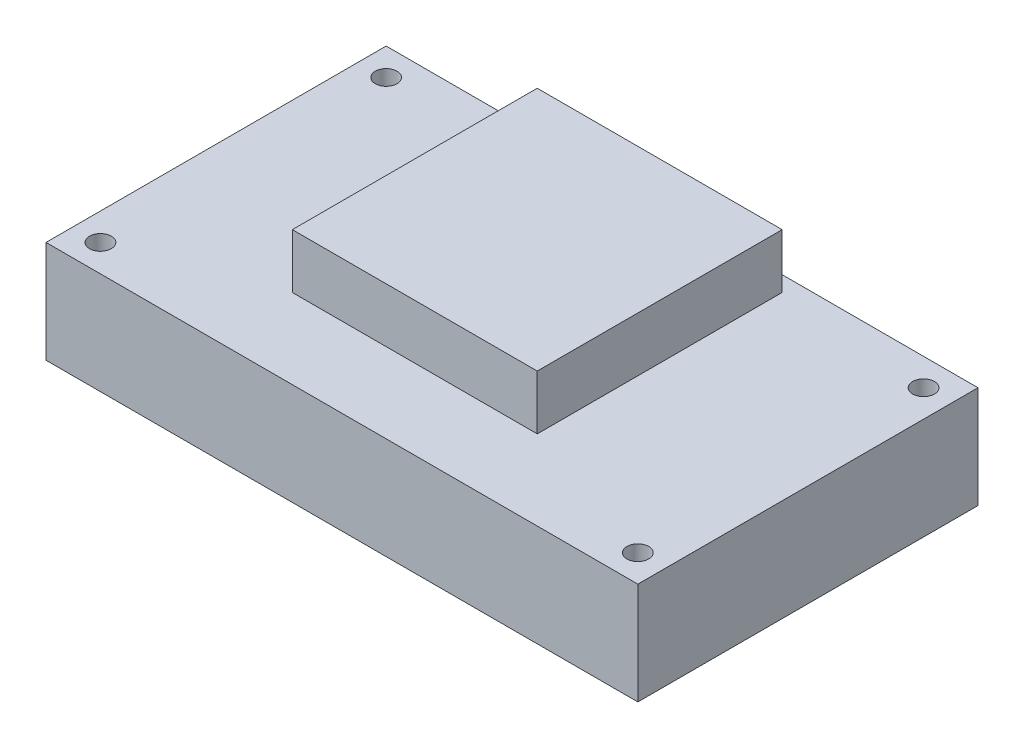
ISO-10303-21;
HEADER;
FILE_DESCRIPTION(('STEP AP214'),'2;1');
FILE_NAME('part.step','',(''),(''),'','','');
FILE_SCHEMA(('AUTOMOTIVE_DESIGN { 1 0 10303 214 1 1 1 1 }'));
ENDSEC;
DATA;
#1=APPLICATION_CONTEXT('core data for automotive mechanical design processes');
#2=APPLICATION_PROTOCOL_DEFINITION('international standard','automotive_design',2000,#1);
#3=PRODUCT_CONTEXT('',#1,'mechanical');
#4=PRODUCT('Part','Part','',(#3));
#5=PRODUCT_RELATED_PRODUCT_CATEGORY('part','',(#4));
#6=PRODUCT_DEFINITION_FORMATION('','',#4);
#7=PRODUCT_DEFINITION_CONTEXT('part definition',#1,'design');
#8=PRODUCT_DEFINITION('design','',#6,#7);
#9=PRODUCT_DEFINITION_SHAPE('','',#8);
#10=(LENGTH_UNIT() NAMED_UNIT(*) SI_UNIT(.MILLI.,.METRE.));
#11=(NAMED_UNIT(*) PLANE_ANGLE_UNIT() SI_UNIT($,.RADIAN.));
#12=(NAMED_UNIT(*) SI_UNIT($,.STERADIAN.) SOLID_ANGLE_UNIT());
#13=UNCERTAINTY_MEASURE_WITH_UNIT(LENGTH_MEASURE(1.E-05),#10,'distance_accuracy_value','');
#14=(GEOMETRIC_REPRESENTATION_CONTEXT(3) GLOBAL_UNCERTAINTY_ASSIGNED_CONTEXT((#13)) GLOBAL_UNIT_ASSIGNED_CONTEXT((#10,
#11,#12)) REPRESENTATION_CONTEXT('',''));
#15=CARTESIAN_POINT('',(0.,0.,0.));
#16=DIRECTION('',(0.,0.,1.));
#17=DIRECTION('',(1.,0.,0.));
#18=AXIS2_PLACEMENT_3D('',#15,#16,#17);
#19=CARTESIAN_POINT('',(0.,15.,0.));
#20=DIRECTION('',(0.,1.,0.));
#21=DIRECTION('',(0.,0.,1.));
#22=AXIS2_PLACEMENT_3D('',#19,#20,#21);
#23=PLANE('',#22);
#24=CARTESIAN_POINT('',(39.5,15.,21.));
#25=DIRECTION('',(0.,1.,0.));
#26=DIRECTION('',(0.,0.,1.));
#27=AXIS2_PLACEMENT_3D('',#24,#25,#26);
#28=CIRCLE('',#27,1.6);
#29=CARTESIAN_POINT('',(39.5,15.,22.6));
#30=VERTEX_POINT('',#29);
#31=EDGE_CURVE('E146',#30,#30,#28,.T.);
#32=ORIENTED_EDGE('',*,*,#31,.F.);
#33=EDGE_LOOP('',(#32));
#34=FACE_BOUND('',#33,.T.);
#35=CARTESIAN_POINT('',(-39.5,15.,-21.));
#36=DIRECTION('',(0.,1.,0.));
#37=DIRECTION('',(0.,0.,1.));
#38=AXIS2_PLACEMENT_3D('',#35,#36,#37);
#39=CIRCLE('',#38,1.6);
#40=CARTESIAN_POINT('',(-39.5,15.,-19.4));
#41=VERTEX_POINT('',#40);
#42=EDGE_CURVE('E158',#41,#41,#39,.T.);
#43=ORIENTED_EDGE('',*,*,#42,.F.);
#44=EDGE_LOOP('',(#43));
#45=FACE_BOUND('',#44,.T.);
#46=DIRECTION('',(0.,0.,-1.));
#47=VECTOR('',#46,1.);
#48=CARTESIAN_POINT('',(43.5,15.,-25.));
#49=LINE('',#48,#47);
#50=CARTESIAN_POINT('',(43.5,15.,25.));
#51=VERTEX_POINT('',#50);
#52=CARTESIAN_POINT('',(43.5,15.,-25.));
#53=VERTEX_POINT('',#52);
#54=EDGE_CURVE('E164',#51,#53,#49,.T.);
#55=ORIENTED_EDGE('',*,*,#54,.T.);
#56=DIRECTION('',(-1.,0.,0.));
#57=VECTOR('',#56,1.);
#58=CARTESIAN_POINT('',(-43.5,15.,-25.));
#59=LINE('',#58,#57);
#60=CARTESIAN_POINT('',(-43.5,15.,-25.));
#61=VERTEX_POINT('',#60);
#62=EDGE_CURVE('E88',#53,#61,#59,.T.);
#63=ORIENTED_EDGE('',*,*,#62,.T.);
#64=DIRECTION('',(0.,0.,1.));
#65=VECTOR('',#64,1.);
#66=CARTESIAN_POINT('',(-43.5,15.,-25.));
#67=LINE('',#66,#65);
#68=CARTESIAN_POINT('',(-43.5,15.,25.));
#69=VERTEX_POINT('',#68);
#70=EDGE_CURVE('E167',#61,#69,#67,.T.);
#71=ORIENTED_EDGE('',*,*,#70,.T.);
#72=DIRECTION('',(1.,0.,0.));
#73=VECTOR('',#72,1.);
#74=CARTESIAN_POINT('',(-43.5,15.,25.));
#75=LINE('',#74,#73);
#76=EDGE_CURVE('E60',#69,#51,#75,.T.);
#77=ORIENTED_EDGE('',*,*,#76,.T.);
#78=EDGE_LOOP('',(#55,#63,#71,#77));
#79=FACE_BOUND('',#78,.T.);
#80=CARTESIAN_POINT('',(39.5,15.,-21.));
#81=DIRECTION('',(0.,1.,0.));
#82=DIRECTION('',(0.,0.,-1.));
#83=AXIS2_PLACEMENT_3D('',#80,#81,#82);
#84=CIRCLE('',#83,1.6);
#85=CARTESIAN_POINT('',(39.5,15.,-22.6));
#86=VERTEX_POINT('',#85);
#87=EDGE_CURVE('E152',#86,#86,#84,.T.);
#88=ORIENTED_EDGE('',*,*,#87,.F.);
#89=EDGE_LOOP('',(#88));
#90=FACE_BOUND('',#89,.T.);
#91=CARTESIAN_POINT('',(-39.5,15.,21.));
#92=DIRECTION('',(0.,1.,0.));
#93=DIRECTION('',(0.,0.,-1.));
#94=AXIS2_PLACEMENT_3D('',#91,#92,#93);
#95=CIRCLE('',#94,1.6);
#96=CARTESIAN_POINT('',(-39.5,15.,19.4));
#97=VERTEX_POINT('',#96);
#98=EDGE_CURVE('E138',#97,#97,#95,.T.);
#99=ORIENTED_EDGE('',*,*,#98,.F.);
#100=EDGE_LOOP('',(#99));
#101=FACE_BOUND('',#100,.T.);
#102=DIRECTION('',(-1.,0.,0.));
#103=VECTOR('',#102,1.);
#104=CARTESIAN_POINT('',(-19.0226817386181,15.,-22.732356082841));
#105=LINE('',#104,#103);
#106=CARTESIAN_POINT('',(16.9773182613819,15.,-22.732356082841));
#107=VERTEX_POINT('',#106);
#108=CARTESIAN_POINT('',(-19.0226817386181,15.,-22.732356082841));
#109=VERTEX_POINT('',#108);
#110=EDGE_CURVE('E334',#107,#109,#105,.T.);
#111=ORIENTED_EDGE('',*,*,#110,.F.);
#112=DIRECTION('',(0.,0.,-1.));
#113=VECTOR('',#112,1.);
#114=CARTESIAN_POINT('',(16.9773182613819,15.,-22.732356082841));
#115=LINE('',#114,#113);
#116=CARTESIAN_POINT('',(16.9773182613819,15.,13.267643917159));
#117=VERTEX_POINT('',#116);
#118=EDGE_CURVE('E133',#117,#107,#115,.T.);
#119=ORIENTED_EDGE('',*,*,#118,.F.);
#120=DIRECTION('',(1.,0.,0.));
#121=VECTOR('',#120,1.);
#122=CARTESIAN_POINT('',(-19.0226817386181,15.,13.267643917159));
#123=LINE('',#122,#121);
#124=CARTESIAN_POINT('',(-19.0226817386181,15.,13.267643917159));
#125=VERTEX_POINT('',#124);
#126=EDGE_CURVE('E129',#125,#117,#123,.T.);
#127=ORIENTED_EDGE('',*,*,#126,.F.);
#128=DIRECTION('',(0.,0.,1.));
#129=VECTOR('',#128,1.);
#130=CARTESIAN_POINT('',(-19.0226817386181,15.,-22.732356082841));
#131=LINE('',#130,#129);
#132=EDGE_CURVE('E331',#109,#125,#131,.T.);
#133=ORIENTED_EDGE('',*,*,#132,.F.);
#134=EDGE_LOOP('',(#111,#119,#127,#133));
#135=FACE_BOUND('',#134,.T.);
#136=ADVANCED_FACE('F36',(#34,#45,#79,#90,#101,#135),#23,.T.);
#137=CARTESIAN_POINT('',(0.,0.,0.));
#138=DIRECTION('',(0.,1.,0.));
#139=DIRECTION('',(0.,0.,1.));
#140=AXIS2_PLACEMENT_3D('',#137,#138,#139);
#141=PLANE('',#140);
#142=DIRECTION('',(0.,0.,-1.));
#143=VECTOR('',#142,1.);
#144=CARTESIAN_POINT('',(43.5,0.,-25.));
#145=LINE('',#144,#143);
#146=CARTESIAN_POINT('',(43.5,0.,25.));
#147=VERTEX_POINT('',#146);
#148=CARTESIAN_POINT('',(43.5,0.,-25.));
#149=VERTEX_POINT('',#148);
#150=EDGE_CURVE('E161',#147,#149,#145,.T.);
#151=ORIENTED_EDGE('',*,*,#150,.F.);
#152=DIRECTION('',(1.,0.,0.));
#153=VECTOR('',#152,1.);
#154=CARTESIAN_POINT('',(-43.5,0.,25.));
#155=LINE('',#154,#153);
#156=CARTESIAN_POINT('',(-43.5,0.,25.));
#157=VERTEX_POINT('',#156);
#158=EDGE_CURVE('E81',#157,#147,#155,.T.);
#159=ORIENTED_EDGE('',*,*,#158,.F.);
#160=DIRECTION('',(0.,0.,1.));
#161=VECTOR('',#160,1.);
#162=CARTESIAN_POINT('',(-43.5,0.,-25.));
#163=LINE('',#162,#161);
#164=CARTESIAN_POINT('',(-43.5,0.,-25.));
#165=VERTEX_POINT('',#164);
#166=EDGE_CURVE('E175',#165,#157,#163,.T.);
#167=ORIENTED_EDGE('',*,*,#166,.F.);
#168=DIRECTION('',(-1.,0.,0.));
#169=VECTOR('',#168,1.);
#170=CARTESIAN_POINT('',(-43.5,0.,-25.));
#171=LINE('',#170,#169);
#172=EDGE_CURVE('E173',#149,#165,#171,.T.);
#173=ORIENTED_EDGE('',*,*,#172,.F.);
#174=EDGE_LOOP('',(#151,#159,#167,#173));
#175=FACE_BOUND('',#174,.T.);
#176=CARTESIAN_POINT('',(-39.5,0.,-21.));
#177=DIRECTION('',(0.,1.,0.));
#178=DIRECTION('',(0.,0.,1.));
#179=AXIS2_PLACEMENT_3D('',#176,#177,#178);
#180=CIRCLE('',#179,1.6);
#181=CARTESIAN_POINT('',(-39.5,0.,-19.4));
#182=VERTEX_POINT('',#181);
#183=EDGE_CURVE('E155',#182,#182,#180,.T.);
#184=ORIENTED_EDGE('',*,*,#183,.T.);
#185=EDGE_LOOP('',(#184));
#186=FACE_BOUND('',#185,.T.);
#187=CARTESIAN_POINT('',(39.5,0.,-21.));
#188=DIRECTION('',(0.,1.,0.));
#189=DIRECTION('',(0.,0.,-1.));
#190=AXIS2_PLACEMENT_3D('',#187,#188,#189);
#191=CIRCLE('',#190,1.6);
#192=CARTESIAN_POINT('',(39.5,0.,-22.6));
#193=VERTEX_POINT('',#192);
#194=EDGE_CURVE('E149',#193,#193,#191,.T.);
#195=ORIENTED_EDGE('',*,*,#194,.T.);
#196=EDGE_LOOP('',(#195));
#197=FACE_BOUND('',#196,.T.);
#198=CARTESIAN_POINT('',(39.5,0.,21.));
#199=DIRECTION('',(0.,1.,0.));
#200=DIRECTION('',(0.,0.,1.));
#201=AXIS2_PLACEMENT_3D('',#198,#199,#200);
#202=CIRCLE('',#201,1.6);
#203=CARTESIAN_POINT('',(39.5,0.,22.6));
#204=VERTEX_POINT('',#203);
#205=EDGE_CURVE('E144',#204,#204,#202,.T.);
#206=ORIENTED_EDGE('',*,*,#205,.T.);
#207=EDGE_LOOP('',(#206));
#208=FACE_BOUND('',#207,.T.);
#209=CARTESIAN_POINT('',(-39.5,0.,21.));
#210=DIRECTION('',(0.,1.,0.));
#211=DIRECTION('',(0.,0.,-1.));
#212=AXIS2_PLACEMENT_3D('',#209,#210,#211);
#213=CIRCLE('',#212,1.6);
#214=CARTESIAN_POINT('',(-39.5,0.,19.4));
#215=VERTEX_POINT('',#214);
#216=EDGE_CURVE('E135',#215,#215,#213,.T.);
#217=ORIENTED_EDGE('',*,*,#216,.T.);
#218=EDGE_LOOP('',(#217));
#219=FACE_BOUND('',#218,.T.);
#220=ADVANCED_FACE('F188',(#175,#186,#197,#208,#219),#141,.F.);
#221=CARTESIAN_POINT('',(43.5,15.,-25.));
#222=DIRECTION('',(-1.,0.,0.));
#223=DIRECTION('',(0.,0.,1.));
#224=AXIS2_PLACEMENT_3D('',#221,#222,#223);
#225=PLANE('',#224);
#226=ORIENTED_EDGE('',*,*,#150,.T.);
#227=DIRECTION('',(0.,-1.,0.));
#228=VECTOR('',#227,1.);
#229=CARTESIAN_POINT('',(43.5,15.,-25.));
#230=LINE('',#229,#228);
#231=EDGE_CURVE('E11',#53,#149,#230,.T.);
#232=ORIENTED_EDGE('',*,*,#231,.F.);
#233=ORIENTED_EDGE('',*,*,#54,.F.);
#234=DIRECTION('',(0.,-1.,0.));
#235=VECTOR('',#234,1.);
#236=CARTESIAN_POINT('',(43.5,15.,25.));
#237=LINE('',#236,#235);
#238=EDGE_CURVE('E170',#51,#147,#237,.T.);
#239=ORIENTED_EDGE('',*,*,#238,.T.);
#240=EDGE_LOOP('',(#226,#232,#233,#239));
#241=FACE_BOUND('',#240,.T.);
#242=ADVANCED_FACE('F38',(#241),#225,.F.);
#243=CARTESIAN_POINT('',(-43.5,15.,-25.));
#244=DIRECTION('',(0.,0.,1.));
#245=DIRECTION('',(1.,0.,0.));
#246=AXIS2_PLACEMENT_3D('',#243,#244,#245);
#247=PLANE('',#246);
#248=ORIENTED_EDGE('',*,*,#172,.T.);
#249=DIRECTION('',(0.,-1.,0.));
#250=VECTOR('',#249,1.);
#251=CARTESIAN_POINT('',(-43.5,15.,-25.));
#252=LINE('',#251,#250);
#253=EDGE_CURVE('E44',#61,#165,#252,.T.);
#254=ORIENTED_EDGE('',*,*,#253,.F.);
#255=ORIENTED_EDGE('',*,*,#62,.F.);
#256=ORIENTED_EDGE('',*,*,#231,.T.);
#257=EDGE_LOOP('',(#248,#254,#255,#256));
#258=FACE_BOUND('',#257,.T.);
#259=ADVANCED_FACE('F204',(#258),#247,.F.);
#260=CARTESIAN_POINT('',(-43.5,15.,-25.));
#261=DIRECTION('',(1.,0.,0.));
#262=DIRECTION('',(0.,0.,-1.));
#263=AXIS2_PLACEMENT_3D('',#260,#261,#262);
#264=PLANE('',#263);
#265=ORIENTED_EDGE('',*,*,#166,.T.);
#266=DIRECTION('',(0.,-1.,0.));
#267=VECTOR('',#266,1.);
#268=CARTESIAN_POINT('',(-43.5,15.,25.));
#269=LINE('',#268,#267);
#270=EDGE_CURVE('E179',#69,#157,#269,.T.);
#271=ORIENTED_EDGE('',*,*,#270,.F.);
#272=ORIENTED_EDGE('',*,*,#70,.F.);
#273=ORIENTED_EDGE('',*,*,#253,.T.);
#274=EDGE_LOOP('',(#265,#271,#272,#273));
#275=FACE_BOUND('',#274,.T.);
#276=ADVANCED_FACE('F184',(#275),#264,.F.);
#277=CARTESIAN_POINT('',(-43.5,15.,25.));
#278=DIRECTION('',(0.,0.,-1.));
#279=DIRECTION('',(-1.,0.,0.));
#280=AXIS2_PLACEMENT_3D('',#277,#278,#279);
#281=PLANE('',#280);
#282=ORIENTED_EDGE('',*,*,#158,.T.);
#283=ORIENTED_EDGE('',*,*,#238,.F.);
#284=ORIENTED_EDGE('',*,*,#76,.F.);
#285=ORIENTED_EDGE('',*,*,#270,.T.);
#286=EDGE_LOOP('',(#282,#283,#284,#285));
#287=FACE_BOUND('',#286,.T.);
#288=ADVANCED_FACE('F193',(#287),#281,.F.);
#289=CARTESIAN_POINT('',(-39.5,15.,-21.));
#290=DIRECTION('',(0.,-1.,0.));
#291=DIRECTION('',(0.,0.,-1.));
#292=AXIS2_PLACEMENT_3D('',#289,#290,#291);
#293=CYLINDRICAL_SURFACE('',#292,1.6);
#294=ORIENTED_EDGE('',*,*,#42,.T.);
#295=EDGE_LOOP('',(#294));
#296=FACE_BOUND('',#295,.T.);
#297=ORIENTED_EDGE('',*,*,#183,.F.);
#298=EDGE_LOOP('',(#297));
#299=FACE_BOUND('',#298,.T.);
#300=ADVANCED_FACE('F195',(#296,#299),#293,.F.);
#301=CARTESIAN_POINT('',(39.5,15.,-21.));
#302=DIRECTION('',(0.,-1.,0.));
#303=DIRECTION('',(0.,0.,-1.));
#304=AXIS2_PLACEMENT_3D('',#301,#302,#303);
#305=CYLINDRICAL_SURFACE('',#304,1.6);
#306=ORIENTED_EDGE('',*,*,#87,.T.);
#307=EDGE_LOOP('',(#306));
#308=FACE_BOUND('',#307,.T.);
#309=ORIENTED_EDGE('',*,*,#194,.F.);
#310=EDGE_LOOP('',(#309));
#311=FACE_BOUND('',#310,.T.);
#312=ADVANCED_FACE('F201',(#308,#311),#305,.F.);
#313=CARTESIAN_POINT('',(39.5,15.,21.));
#314=DIRECTION('',(0.,-1.,0.));
#315=DIRECTION('',(0.,0.,-1.));
#316=AXIS2_PLACEMENT_3D('',#313,#314,#315);
#317=CYLINDRICAL_SURFACE('',#316,1.6);
#318=ORIENTED_EDGE('',*,*,#31,.T.);
#319=EDGE_LOOP('',(#318));
#320=FACE_BOUND('',#319,.T.);
#321=ORIENTED_EDGE('',*,*,#205,.F.);
#322=EDGE_LOOP('',(#321));
#323=FACE_BOUND('',#322,.T.);
#324=ADVANCED_FACE('F218',(#320,#323),#317,.F.);
#325=CARTESIAN_POINT('',(-39.5,15.,21.));
#326=DIRECTION('',(0.,-1.,0.));
#327=DIRECTION('',(0.,0.,-1.));
#328=AXIS2_PLACEMENT_3D('',#325,#326,#327);
#329=CYLINDRICAL_SURFACE('',#328,1.6);
#330=ORIENTED_EDGE('',*,*,#98,.T.);
#331=EDGE_LOOP('',(#330));
#332=FACE_BOUND('',#331,.T.);
#333=ORIENTED_EDGE('',*,*,#216,.F.);
#334=EDGE_LOOP('',(#333));
#335=FACE_BOUND('',#334,.T.);
#336=ADVANCED_FACE('F222',(#332,#335),#329,.F.);
#337=CARTESIAN_POINT('',(16.9773182613819,23.,-22.732356082841));
#338=DIRECTION('',(-1.,0.,0.));
#339=DIRECTION('',(0.,0.,1.));
#340=AXIS2_PLACEMENT_3D('',#337,#338,#339);
#341=PLANE('',#340);
#342=ORIENTED_EDGE('',*,*,#118,.T.);
#343=DIRECTION('',(0.,-1.,0.));
#344=VECTOR('',#343,1.);
#345=CARTESIAN_POINT('',(16.9773182613819,23.,-22.732356082841));
#346=LINE('',#345,#344);
#347=CARTESIAN_POINT('',(16.9773182613819,23.,-22.732356082841));
#348=VERTEX_POINT('',#347);
#349=EDGE_CURVE('E114',#348,#107,#346,.T.);
#350=ORIENTED_EDGE('',*,*,#349,.F.);
#351=DIRECTION('',(0.,0.,-1.));
#352=VECTOR('',#351,1.);
#353=CARTESIAN_POINT('',(16.9773182613819,23.,-22.732356082841));
#354=LINE('',#353,#352);
#355=CARTESIAN_POINT('',(16.9773182613819,23.,13.267643917159));
#356=VERTEX_POINT('',#355);
#357=EDGE_CURVE('E121',#356,#348,#354,.T.);
#358=ORIENTED_EDGE('',*,*,#357,.F.);
#359=DIRECTION('',(0.,-1.,0.));
#360=VECTOR('',#359,1.);
#361=CARTESIAN_POINT('',(16.9773182613819,23.,13.267643917159));
#362=LINE('',#361,#360);
#363=EDGE_CURVE('E328',#356,#117,#362,.T.);
#364=ORIENTED_EDGE('',*,*,#363,.T.);
#365=EDGE_LOOP('',(#342,#350,#358,#364));
#366=FACE_BOUND('',#365,.T.);
#367=ADVANCED_FACE('F131',(#366),#341,.F.);
#368=CARTESIAN_POINT('',(-19.0226817386181,23.,-22.732356082841));
#369=DIRECTION('',(0.,0.,1.));
#370=DIRECTION('',(1.,0.,0.));
#371=AXIS2_PLACEMENT_3D('',#368,#369,#370);
#372=PLANE('',#371);
#373=ORIENTED_EDGE('',*,*,#110,.T.);
#374=DIRECTION('',(0.,-1.,0.));
#375=VECTOR('',#374,1.);
#376=CARTESIAN_POINT('',(-19.0226817386181,23.,-22.732356082841));
#377=LINE('',#376,#375);
#378=CARTESIAN_POINT('',(-19.0226817386181,23.,-22.732356082841));
#379=VERTEX_POINT('',#378);
#380=EDGE_CURVE('E117',#379,#109,#377,.T.);
#381=ORIENTED_EDGE('',*,*,#380,.F.);
#382=DIRECTION('',(-1.,0.,0.));
#383=VECTOR('',#382,1.);
#384=CARTESIAN_POINT('',(-19.0226817386181,23.,-22.732356082841));
#385=LINE('',#384,#383);
#386=EDGE_CURVE('E110',#348,#379,#385,.T.);
#387=ORIENTED_EDGE('',*,*,#386,.F.);
#388=ORIENTED_EDGE('',*,*,#349,.T.);
#389=EDGE_LOOP('',(#373,#381,#387,#388));
#390=FACE_BOUND('',#389,.T.);
#391=ADVANCED_FACE('F112',(#390),#372,.F.);
#392=CARTESIAN_POINT('',(-19.0226817386181,23.,-22.732356082841));
#393=DIRECTION('',(1.,0.,0.));
#394=DIRECTION('',(0.,0.,-1.));
#395=AXIS2_PLACEMENT_3D('',#392,#393,#394);
#396=PLANE('',#395);
#397=ORIENTED_EDGE('',*,*,#132,.T.);
#398=DIRECTION('',(0.,-1.,0.));
#399=VECTOR('',#398,1.);
#400=CARTESIAN_POINT('',(-19.0226817386181,23.,13.267643917159));
#401=LINE('',#400,#399);
#402=CARTESIAN_POINT('',(-19.0226817386181,23.,13.267643917159));
#403=VERTEX_POINT('',#402);
#404=EDGE_CURVE('E51',#403,#125,#401,.T.);
#405=ORIENTED_EDGE('',*,*,#404,.F.);
#406=DIRECTION('',(0.,0.,1.));
#407=VECTOR('',#406,1.);
#408=CARTESIAN_POINT('',(-19.0226817386181,23.,-22.732356082841));
#409=LINE('',#408,#407);
#410=EDGE_CURVE('E120',#379,#403,#409,.T.);
#411=ORIENTED_EDGE('',*,*,#410,.F.);
#412=ORIENTED_EDGE('',*,*,#380,.T.);
#413=EDGE_LOOP('',(#397,#405,#411,#412));
#414=FACE_BOUND('',#413,.T.);
#415=ADVANCED_FACE('F231',(#414),#396,.F.);
#416=CARTESIAN_POINT('',(-19.0226817386181,23.,13.267643917159));
#417=DIRECTION('',(0.,0.,-1.));
#418=DIRECTION('',(-1.,0.,0.));
#419=AXIS2_PLACEMENT_3D('',#416,#417,#418);
#420=PLANE('',#419);
#421=ORIENTED_EDGE('',*,*,#126,.T.);
#422=ORIENTED_EDGE('',*,*,#363,.F.);
#423=DIRECTION('',(1.,0.,0.));
#424=VECTOR('',#423,1.);
#425=CARTESIAN_POINT('',(-19.0226817386181,23.,13.267643917159));
#426=LINE('',#425,#424);
#427=EDGE_CURVE('E125',#403,#356,#426,.T.);
#428=ORIENTED_EDGE('',*,*,#427,.F.);
#429=ORIENTED_EDGE('',*,*,#404,.T.);
#430=EDGE_LOOP('',(#421,#422,#428,#429));
#431=FACE_BOUND('',#430,.T.);
#432=ADVANCED_FACE('F234',(#431),#420,.F.);
#433=CARTESIAN_POINT('',(0.,23.,0.));
#434=DIRECTION('',(0.,1.,0.));
#435=DIRECTION('',(0.,0.,1.));
#436=AXIS2_PLACEMENT_3D('',#433,#434,#435);
#437=PLANE('',#436);
#438=ORIENTED_EDGE('',*,*,#357,.T.);
#439=ORIENTED_EDGE('',*,*,#386,.T.);
#440=ORIENTED_EDGE('',*,*,#410,.T.);
#441=ORIENTED_EDGE('',*,*,#427,.T.);
#442=EDGE_LOOP('',(#438,#439,#440,#441));
#443=FACE_BOUND('',#442,.T.);
#444=ADVANCED_FACE('F124',(#443),#437,.T.);
#445=CLOSED_SHELL('',(#136,#220,#242,#259,#276,#288,#300,#312,#324,#336,#367,#391,#415,#432,#444));
#446=MANIFOLD_SOLID_BREP('B2',#445);
#447=ADVANCED_BREP_SHAPE_REPRESENTATION('',(#18,#446),#14);
#448=SHAPE_DEFINITION_REPRESENTATION(#9,#447);
ENDSEC;
END-ISO-10303-21;
